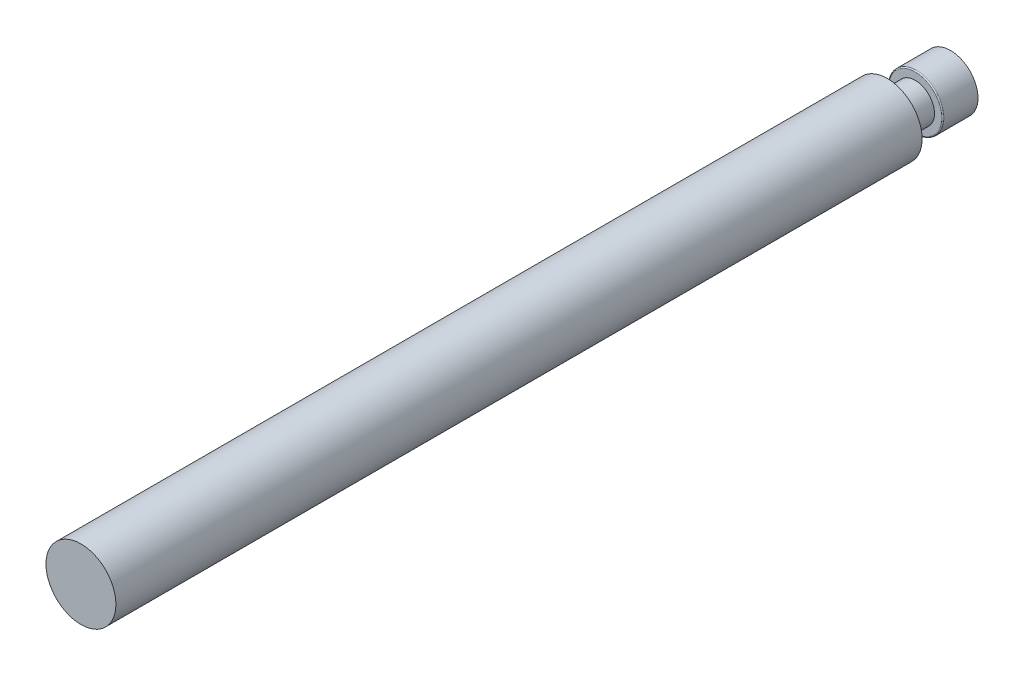
ISO-10303-21;
HEADER;
FILE_DESCRIPTION(('STEP AP214'),'2;1');
FILE_NAME('part.step','',(''),(''),'','','');
FILE_SCHEMA(('AUTOMOTIVE_DESIGN { 1 0 10303 214 1 1 1 1 }'));
ENDSEC;
DATA;
#1=APPLICATION_CONTEXT('core data for automotive mechanical design processes');
#2=APPLICATION_PROTOCOL_DEFINITION('international standard','automotive_design',2000,#1);
#3=PRODUCT_CONTEXT('',#1,'mechanical');
#4=PRODUCT('Part','Part','',(#3));
#5=PRODUCT_RELATED_PRODUCT_CATEGORY('part','',(#4));
#6=PRODUCT_DEFINITION_FORMATION('','',#4);
#7=PRODUCT_DEFINITION_CONTEXT('part definition',#1,'design');
#8=PRODUCT_DEFINITION('design','',#6,#7);
#9=PRODUCT_DEFINITION_SHAPE('','',#8);
#10=(LENGTH_UNIT() NAMED_UNIT(*) SI_UNIT(.MILLI.,.METRE.));
#11=(NAMED_UNIT(*) PLANE_ANGLE_UNIT() SI_UNIT($,.RADIAN.));
#12=(NAMED_UNIT(*) SI_UNIT($,.STERADIAN.) SOLID_ANGLE_UNIT());
#13=UNCERTAINTY_MEASURE_WITH_UNIT(LENGTH_MEASURE(1.E-05),#10,'distance_accuracy_value','');
#14=(GEOMETRIC_REPRESENTATION_CONTEXT(3) GLOBAL_UNCERTAINTY_ASSIGNED_CONTEXT((#13)) GLOBAL_UNIT_ASSIGNED_CONTEXT((#10,
#11,#12)) REPRESENTATION_CONTEXT('',''));
#15=CARTESIAN_POINT('',(0.,0.,0.));
#16=DIRECTION('',(0.,0.,1.));
#17=DIRECTION('',(1.,0.,0.));
#18=AXIS2_PLACEMENT_3D('',#15,#16,#17);
#19=CARTESIAN_POINT('',(0.,0.,160.));
#20=DIRECTION('',(0.,0.,-1.));
#21=DIRECTION('',(-1.,0.,0.));
#22=AXIS2_PLACEMENT_3D('',#19,#20,#21);
#23=CYLINDRICAL_SURFACE('',#22,6.35);
#24=CARTESIAN_POINT('',(0.,0.,13.5));
#25=DIRECTION('',(0.,0.,-1.));
#26=DIRECTION('',(-1.,0.,0.));
#27=AXIS2_PLACEMENT_3D('',#24,#25,#26);
#28=CIRCLE('',#27,6.35);
#29=CARTESIAN_POINT('',(-6.35,0.,13.5));
#30=VERTEX_POINT('',#29);
#31=EDGE_CURVE('E11',#30,#30,#28,.F.);
#32=ORIENTED_EDGE('',*,*,#31,.T.);
#33=EDGE_LOOP('',(#32));
#34=FACE_BOUND('',#33,.T.);
#35=CARTESIAN_POINT('',(0.,0.,160.));
#36=DIRECTION('',(0.,0.,1.));
#37=DIRECTION('',(1.,0.,0.));
#38=AXIS2_PLACEMENT_3D('',#35,#36,#37);
#39=CIRCLE('',#38,6.35);
#40=CARTESIAN_POINT('',(6.35,0.,160.));
#41=VERTEX_POINT('',#40);
#42=EDGE_CURVE('E59',#41,#41,#39,.T.);
#43=ORIENTED_EDGE('',*,*,#42,.F.);
#44=EDGE_LOOP('',(#43));
#45=FACE_BOUND('',#44,.T.);
#46=ADVANCED_FACE('F33',(#34,#45),#23,.T.);
#47=CARTESIAN_POINT('',(0.,0.,160.));
#48=DIRECTION('',(0.,0.,1.));
#49=DIRECTION('',(1.,0.,0.));
#50=AXIS2_PLACEMENT_3D('',#47,#48,#49);
#51=PLANE('',#50);
#52=ORIENTED_EDGE('',*,*,#42,.T.);
#53=EDGE_LOOP('',(#52));
#54=FACE_BOUND('',#53,.T.);
#55=ADVANCED_FACE('F80',(#54),#51,.T.);
#56=CARTESIAN_POINT('',(0.,0.,12.));
#57=DIRECTION('',(0.,0.,-1.));
#58=DIRECTION('',(-1.,0.,0.));
#59=AXIS2_PLACEMENT_3D('',#56,#57,#58);
#60=PLANE('',#59);
#61=CARTESIAN_POINT('',(0.,0.,12.));
#62=DIRECTION('',(0.,0.,-1.));
#63=DIRECTION('',(-1.,0.,0.));
#64=AXIS2_PLACEMENT_3D('',#61,#62,#63);
#65=CIRCLE('',#64,3.75192378864659);
#66=CARTESIAN_POINT('',(-3.75192378864659,0.,12.));
#67=VERTEX_POINT('',#66);
#68=EDGE_CURVE('E40',#67,#67,#65,.T.);
#69=ORIENTED_EDGE('',*,*,#68,.T.);
#70=EDGE_LOOP('',(#69));
#71=FACE_BOUND('',#70,.T.);
#72=CARTESIAN_POINT('',(0.,0.,12.));
#73=DIRECTION('',(0.,0.,-1.));
#74=DIRECTION('',(-1.,0.,0.));
#75=AXIS2_PLACEMENT_3D('',#72,#73,#74);
#76=CIRCLE('',#75,3.5);
#77=CARTESIAN_POINT('',(-3.5,0.,12.));
#78=VERTEX_POINT('',#77);
#79=EDGE_CURVE('E63',#78,#78,#76,.T.);
#80=ORIENTED_EDGE('',*,*,#79,.F.);
#81=EDGE_LOOP('',(#80));
#82=FACE_BOUND('',#81,.T.);
#83=ADVANCED_FACE('F78',(#71,#82),#60,.T.);
#84=CARTESIAN_POINT('',(0.,0.,8.4));
#85=DIRECTION('',(0.,0.,-1.));
#86=DIRECTION('',(-1.,0.,0.));
#87=AXIS2_PLACEMENT_3D('',#84,#85,#86);
#88=PLANE('',#87);
#89=CARTESIAN_POINT('',(0.,0.,8.4));
#90=DIRECTION('',(0.,0.,-1.));
#91=DIRECTION('',(-1.,0.,0.));
#92=AXIS2_PLACEMENT_3D('',#89,#90,#91);
#93=CIRCLE('',#92,4.8);
#94=CARTESIAN_POINT('',(-4.8,0.,8.4));
#95=VERTEX_POINT('',#94);
#96=EDGE_CURVE('E56',#95,#95,#93,.F.);
#97=ORIENTED_EDGE('',*,*,#96,.T.);
#98=EDGE_LOOP('',(#97));
#99=FACE_BOUND('',#98,.T.);
#100=CARTESIAN_POINT('',(0.,0.,8.4));
#101=DIRECTION('',(0.,0.,-1.));
#102=DIRECTION('',(-1.,0.,0.));
#103=AXIS2_PLACEMENT_3D('',#100,#101,#102);
#104=CIRCLE('',#103,3.5);
#105=CARTESIAN_POINT('',(-3.5,0.,8.4));
#106=VERTEX_POINT('',#105);
#107=EDGE_CURVE('E62',#106,#106,#104,.T.);
#108=ORIENTED_EDGE('',*,*,#107,.T.);
#109=EDGE_LOOP('',(#108));
#110=FACE_BOUND('',#109,.T.);
#111=ADVANCED_FACE('F69',(#99,#110),#88,.F.);
#112=CARTESIAN_POINT('',(0.,0.,8.4));
#113=DIRECTION('',(0.,0.,1.));
#114=DIRECTION('',(1.,0.,0.));
#115=AXIS2_PLACEMENT_3D('',#112,#113,#114);
#116=CYLINDRICAL_SURFACE('',#115,3.5);
#117=ORIENTED_EDGE('',*,*,#107,.F.);
#118=EDGE_LOOP('',(#117));
#119=FACE_BOUND('',#118,.T.);
#120=ORIENTED_EDGE('',*,*,#79,.T.);
#121=EDGE_LOOP('',(#120));
#122=FACE_BOUND('',#121,.T.);
#123=ADVANCED_FACE('F71',(#119,#122),#116,.T.);
#124=CARTESIAN_POINT('',(0.,0.,0.));
#125=DIRECTION('',(0.,0.,1.));
#126=DIRECTION('',(1.,0.,0.));
#127=AXIS2_PLACEMENT_3D('',#124,#125,#126);
#128=PLANE('',#127);
#129=CARTESIAN_POINT('',(0.,0.,0.));
#130=DIRECTION('',(0.,0.,1.));
#131=DIRECTION('',(1.,0.,0.));
#132=AXIS2_PLACEMENT_3D('',#129,#130,#131);
#133=CIRCLE('',#132,1.53589838486223);
#134=CARTESIAN_POINT('',(1.53589838486223,0.,0.));
#135=VERTEX_POINT('',#134);
#136=EDGE_CURVE('E48',#135,#135,#133,.F.);
#137=ORIENTED_EDGE('',*,*,#136,.T.);
#138=EDGE_LOOP('',(#137));
#139=FACE_BOUND('',#138,.T.);
#140=ADVANCED_FACE('F74',(#139),#128,.F.);
#141=CARTESIAN_POINT('',(0.,0.,12.));
#142=DIRECTION('',(0.,0.,-1.));
#143=DIRECTION('',(-1.,0.,0.));
#144=AXIS2_PLACEMENT_3D('',#141,#142,#143);
#145=CYLINDRICAL_SURFACE('',#144,5.);
#146=CARTESIAN_POINT('',(0.,0.,2.00000000000001));
#147=DIRECTION('',(0.,0.,1.));
#148=DIRECTION('',(1.,0.,0.));
#149=AXIS2_PLACEMENT_3D('',#146,#147,#148);
#150=CIRCLE('',#149,5.);
#151=CARTESIAN_POINT('',(5.,0.,2.00000000000001));
#152=VERTEX_POINT('',#151);
#153=EDGE_CURVE('E44',#152,#152,#150,.T.);
#154=ORIENTED_EDGE('',*,*,#153,.T.);
#155=EDGE_LOOP('',(#154));
#156=FACE_BOUND('',#155,.T.);
#157=CARTESIAN_POINT('',(0.,0.,8.2));
#158=DIRECTION('',(0.,0.,-1.));
#159=DIRECTION('',(-1.,0.,0.));
#160=AXIS2_PLACEMENT_3D('',#157,#158,#159);
#161=CIRCLE('',#160,5.);
#162=CARTESIAN_POINT('',(-5.,0.,8.2));
#163=VERTEX_POINT('',#162);
#164=EDGE_CURVE('E53',#163,#163,#161,.T.);
#165=ORIENTED_EDGE('',*,*,#164,.T.);
#166=EDGE_LOOP('',(#165));
#167=FACE_BOUND('',#166,.T.);
#168=ADVANCED_FACE('F101',(#156,#167),#145,.T.);
#169=CARTESIAN_POINT('',(0.,0.,8.2));
#170=DIRECTION('',(0.,0.,-1.));
#171=DIRECTION('',(-1.,0.,0.));
#172=AXIS2_PLACEMENT_3D('',#169,#170,#171);
#173=TOROIDAL_SURFACE('',#172,4.8,0.2);
#174=ORIENTED_EDGE('',*,*,#164,.F.);
#175=EDGE_LOOP('',(#174));
#176=FACE_BOUND('',#175,.T.);
#177=ORIENTED_EDGE('',*,*,#96,.F.);
#178=EDGE_LOOP('',(#177));
#179=FACE_BOUND('',#178,.T.);
#180=ADVANCED_FACE('F98',(#176,#179),#173,.T.);
#181=CARTESIAN_POINT('',(0.,0.,0.));
#182=DIRECTION('',(0.,0.,1.));
#183=DIRECTION('',(1.,0.,0.));
#184=AXIS2_PLACEMENT_3D('',#181,#182,#183);
#185=CONICAL_SURFACE('',#184,1.53589838486223,1.0471975511966);
#186=CARTESIAN_POINT('',(5.,0.,2.00000000000001));
#187=CARTESIAN_POINT('',(4.96391560817565,0.,1.97916666666668));
#188=CARTESIAN_POINT('',(4.9278312163513,0.,1.95833333333335));
#189=CARTESIAN_POINT('',(4.85566243270259,0.,1.91666666666668));
#190=CARTESIAN_POINT('',(4.81957804087824,0.,1.89583333333335));
#191=CARTESIAN_POINT('',(4.74740925722954,0.,1.85416666666668));
#192=CARTESIAN_POINT('',(4.71132486540519,0.,1.83333333333335));
#193=CARTESIAN_POINT('',(4.63915608175648,0.,1.79166666666668));
#194=CARTESIAN_POINT('',(4.60307168993213,0.,1.77083333333335));
#195=CARTESIAN_POINT('',(4.53090290628343,0.,1.72916666666668));
#196=CARTESIAN_POINT('',(4.49481851445908,0.,1.70833333333335));
#197=CARTESIAN_POINT('',(4.42264973081037,0.,1.66666666666668));
#198=CARTESIAN_POINT('',(4.38656533898602,0.,1.64583333333334));
#199=CARTESIAN_POINT('',(4.31439655533732,0.,1.60416666666668));
#200=CARTESIAN_POINT('',(4.27831216351297,0.,1.58333333333334));
#201=CARTESIAN_POINT('',(4.20614337986426,0.,1.54166666666668));
#202=CARTESIAN_POINT('',(4.17005898803991,0.,1.52083333333334));
#203=CARTESIAN_POINT('',(4.09789020439121,0.,1.47916666666668));
#204=CARTESIAN_POINT('',(4.06180581256686,0.,1.45833333333334));
#205=CARTESIAN_POINT('',(3.98963702891815,0.,1.41666666666668));
#206=CARTESIAN_POINT('',(3.9535526370938,0.,1.39583333333334));
#207=CARTESIAN_POINT('',(3.8813838534451,0.,1.35416666666668));
#208=CARTESIAN_POINT('',(3.84529946162074,0.,1.33333333333334));
#209=CARTESIAN_POINT('',(3.77313067797204,0.,1.29166666666668));
#210=CARTESIAN_POINT('',(3.73704628614769,0.,1.27083333333334));
#211=CARTESIAN_POINT('',(3.66487750249899,0.,1.22916666666668));
#212=CARTESIAN_POINT('',(3.62879311067463,0.,1.20833333333334));
#213=CARTESIAN_POINT('',(3.55662432702593,0.,1.16666666666667));
#214=CARTESIAN_POINT('',(3.52053993520158,0.,1.14583333333334));
#215=CARTESIAN_POINT('',(3.44837115155288,0.,1.10416666666667));
#216=CARTESIAN_POINT('',(3.41228675972852,0.,1.08333333333334));
#217=CARTESIAN_POINT('',(3.34011797607982,0.,1.04166666666667));
#218=CARTESIAN_POINT('',(3.30403358425547,0.,1.02083333333334));
#219=CARTESIAN_POINT('',(3.23186480060677,0.,0.979166666666674));
#220=CARTESIAN_POINT('',(3.19578040878241,0.,0.95833333333334));
#221=CARTESIAN_POINT('',(3.12361162513371,0.,0.916666666666673));
#222=CARTESIAN_POINT('',(3.08752723330936,0.,0.895833333333339));
#223=CARTESIAN_POINT('',(3.01535844966065,0.,0.854166666666673));
#224=CARTESIAN_POINT('',(2.9792740578363,0.,0.833333333333339));
#225=CARTESIAN_POINT('',(2.9071052741876,0.,0.791666666666672));
#226=CARTESIAN_POINT('',(2.87102088236325,0.,0.770833333333339));
#227=CARTESIAN_POINT('',(2.79885209871454,0.,0.729166666666672));
#228=CARTESIAN_POINT('',(2.76276770689019,0.,0.708333333333338));
#229=CARTESIAN_POINT('',(2.69059892324149,0.,0.666666666666671));
#230=CARTESIAN_POINT('',(2.65451453141714,0.,0.645833333333338));
#231=CARTESIAN_POINT('',(2.58234574776843,0.,0.604166666666671));
#232=CARTESIAN_POINT('',(2.54626135594408,0.,0.583333333333337));
#233=CARTESIAN_POINT('',(2.47409257229538,0.,0.54166666666667));
#234=CARTESIAN_POINT('',(2.43800818047103,0.,0.520833333333337));
#235=CARTESIAN_POINT('',(2.36583939682232,0.,0.47916666666667));
#236=CARTESIAN_POINT('',(2.32975500499797,0.,0.458333333333336));
#237=CARTESIAN_POINT('',(2.25758622134927,0.,0.41666666666667));
#238=CARTESIAN_POINT('',(2.22150182952492,0.,0.395833333333336));
#239=CARTESIAN_POINT('',(2.14933304587621,0.,0.354166666666669));
#240=CARTESIAN_POINT('',(2.11324865405186,0.,0.333333333333336));
#241=CARTESIAN_POINT('',(2.04107987040316,0.,0.291666666666669));
#242=CARTESIAN_POINT('',(2.00499547857881,0.,0.270833333333335));
#243=CARTESIAN_POINT('',(1.9328266949301,0.,0.229166666666668));
#244=CARTESIAN_POINT('',(1.89674230310575,0.,0.208333333333335));
#245=CARTESIAN_POINT('',(1.82457351945705,0.,0.166666666666668));
#246=CARTESIAN_POINT('',(1.7884891276327,0.,0.145833333333334));
#247=CARTESIAN_POINT('',(1.71632034398399,0.,0.104166666666667));
#248=CARTESIAN_POINT('',(1.68023595215964,0.,0.083333333333334));
#249=CARTESIAN_POINT('',(1.60806716851094,0.,0.041666666666667));
#250=CARTESIAN_POINT('',(1.57198277668659,0.,0.0208333333333335));
#251=CARTESIAN_POINT('',(1.53589838486223,0.,0.));
#252=B_SPLINE_CURVE_WITH_KNOTS('',3,(#186,#187,#188,#189,#190,#191,#192,#193,#194,#195,#196,
#197,#198,#199,#200,#201,#202,#203,#204,#205,#206,#207,#208,#209,#210,#211,#212,#213,#214,#215,
#216,#217,#218,#219,#220,#221,#222,#223,#224,#225,#226,#227,#228,#229,#230,#231,#232,#233,#234,
#235,#236,#237,#238,#239,#240,#241,#242,#243,#244,#245,#246,#247,#248,#249,#250,#251),
.UNSPECIFIED.,.F.,.F.,(4,2,2,2,2,2,2,2,2,2,2,2,2,2,2,2,2,2,2,2,2,2,2,2,2,2,2,2,2,2,2,2,4),(0.,
0.125000000000001,0.250000000000001,0.375000000000001,0.500000000000002,0.625000000000003,
0.750000000000003,0.875000000000004,1.,1.12500000000001,1.25000000000001,1.37500000000001,
1.50000000000001,1.62500000000001,1.75000000000001,1.87500000000001,2.00000000000001,
2.12500000000001,2.25000000000001,2.37500000000001,2.50000000000001,2.62500000000001,
2.75000000000001,2.87500000000001,3.00000000000001,3.12500000000001,3.25000000000001,
3.37500000000001,3.50000000000001,3.62500000000002,3.75000000000002,3.87500000000002,
4.00000000000002),.UNSPECIFIED.);
#253=EDGE_CURVE('BSEAM100',#152,#135,#252,.T.);
#254=ORIENTED_EDGE('',*,*,#153,.F.);
#255=ORIENTED_EDGE('',*,*,#136,.F.);
#256=ORIENTED_EDGE('',*,*,#253,.T.);
#257=ORIENTED_EDGE('',*,*,#253,.F.);
#258=EDGE_LOOP('',(#254,#256,#255,#257));
#259=FACE_BOUND('',#258,.T.);
#260=ADVANCED_FACE('F100',(#259),#185,.T.);
#261=CARTESIAN_POINT('',(0.,0.,12.));
#262=DIRECTION('',(0.,0.,1.));
#263=DIRECTION('',(1.,0.,0.));
#264=AXIS2_PLACEMENT_3D('',#261,#262,#263);
#265=CONICAL_SURFACE('',#264,3.75192378864661,1.0471975511966);
#266=ORIENTED_EDGE('',*,*,#31,.F.);
#267=EDGE_LOOP('',(#266));
#268=FACE_BOUND('',#267,.T.);
#269=ORIENTED_EDGE('',*,*,#68,.F.);
#270=EDGE_LOOP('',(#269));
#271=FACE_BOUND('',#270,.T.);
#272=ADVANCED_FACE('F35',(#268,#271),#265,.T.);
#273=CLOSED_SHELL('',(#46,#55,#83,#111,#123,#140,#168,#180,#260,#272));
#274=MANIFOLD_SOLID_BREP('B2',#273);
#275=ADVANCED_BREP_SHAPE_REPRESENTATION('',(#18,#274),#14);
#276=SHAPE_DEFINITION_REPRESENTATION(#9,#275);
ENDSEC;
END-ISO-10303-21;
